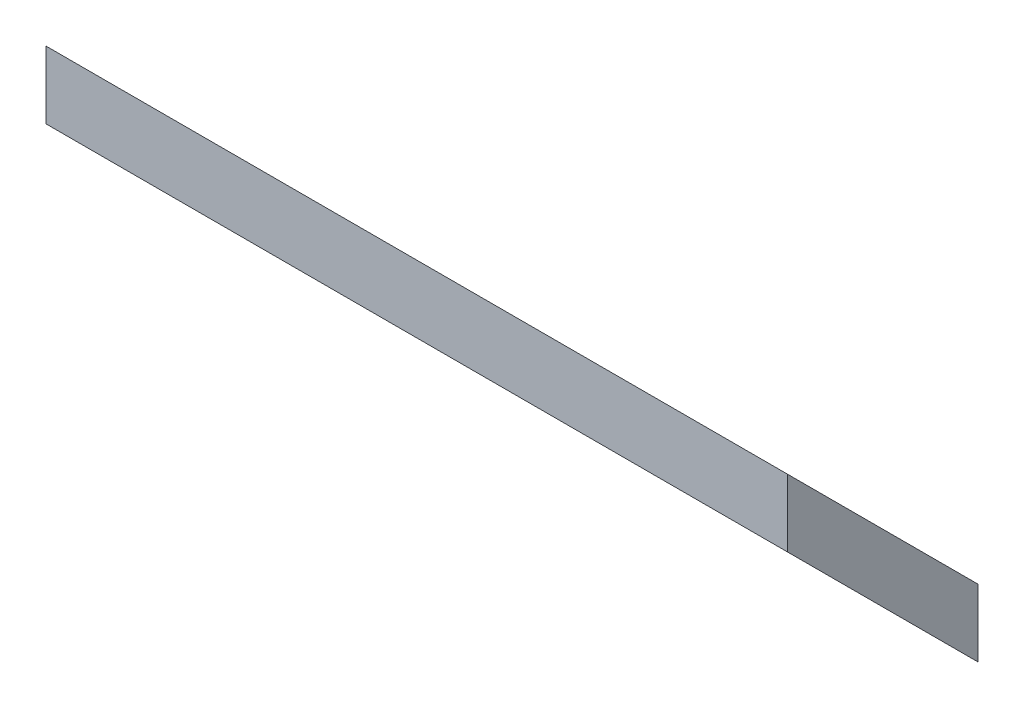
ISO-10303-21;
HEADER;
FILE_DESCRIPTION(('STEP AP214'),'2;1');
FILE_NAME('part.step','',(''),(''),'','','');
FILE_SCHEMA(('AUTOMOTIVE_DESIGN { 1 0 10303 214 1 1 1 1 }'));
ENDSEC;
DATA;
#1=APPLICATION_CONTEXT('core data for automotive mechanical design processes');
#2=APPLICATION_PROTOCOL_DEFINITION('international standard','automotive_design',2000,#1);
#3=PRODUCT_CONTEXT('',#1,'mechanical');
#4=PRODUCT('Part','Part','',(#3));
#5=PRODUCT_RELATED_PRODUCT_CATEGORY('part','',(#4));
#6=PRODUCT_DEFINITION_FORMATION('','',#4);
#7=PRODUCT_DEFINITION_CONTEXT('part definition',#1,'design');
#8=PRODUCT_DEFINITION('design','',#6,#7);
#9=PRODUCT_DEFINITION_SHAPE('','',#8);
#10=(LENGTH_UNIT() NAMED_UNIT(*) SI_UNIT(.MILLI.,.METRE.));
#11=(NAMED_UNIT(*) PLANE_ANGLE_UNIT() SI_UNIT($,.RADIAN.));
#12=(NAMED_UNIT(*) SI_UNIT($,.STERADIAN.) SOLID_ANGLE_UNIT());
#13=UNCERTAINTY_MEASURE_WITH_UNIT(LENGTH_MEASURE(1.E-05),#10,'distance_accuracy_value','');
#14=(GEOMETRIC_REPRESENTATION_CONTEXT(3) GLOBAL_UNCERTAINTY_ASSIGNED_CONTEXT((#13)) GLOBAL_UNIT_ASSIGNED_CONTEXT((#10,
#11,#12)) REPRESENTATION_CONTEXT('',''));
#15=CARTESIAN_POINT('',(0.,0.,0.));
#16=DIRECTION('',(0.,0.,1.));
#17=DIRECTION('',(1.,0.,0.));
#18=AXIS2_PLACEMENT_3D('',#15,#16,#17);
#19=CARTESIAN_POINT('',(0.,0.,0.));
#20=DIRECTION('',(0.,0.,1.));
#21=DIRECTION('',(1.,0.,0.));
#22=AXIS2_PLACEMENT_3D('',#19,#20,#21);
#23=PLANE('',#22);
#24=DIRECTION('',(0.,1.,0.));
#25=VECTOR('',#24,1.);
#26=CARTESIAN_POINT('',(69.85,12.7,0.));
#27=LINE('',#26,#25);
#28=CARTESIAN_POINT('',(69.85,0.,0.));
#29=VERTEX_POINT('',#28);
#30=CARTESIAN_POINT('',(69.85,12.7,0.));
#31=VERTEX_POINT('',#30);
#32=EDGE_CURVE('E68',#29,#31,#27,.T.);
#33=ORIENTED_EDGE('',*,*,#32,.F.);
#34=DIRECTION('',(1.,0.,0.));
#35=VECTOR('',#34,1.);
#36=CARTESIAN_POINT('',(-69.85,0.,0.));
#37=LINE('',#36,#35);
#38=CARTESIAN_POINT('',(-69.85,0.,0.));
#39=VERTEX_POINT('',#38);
#40=EDGE_CURVE('E72',#39,#29,#37,.T.);
#41=ORIENTED_EDGE('',*,*,#40,.F.);
#42=DIRECTION('',(0.,-1.,0.));
#43=VECTOR('',#42,1.);
#44=CARTESIAN_POINT('',(-69.85,12.7,0.));
#45=LINE('',#44,#43);
#46=CARTESIAN_POINT('',(-69.85,12.7,0.));
#47=VERTEX_POINT('',#46);
#48=EDGE_CURVE('E75',#47,#39,#45,.T.);
#49=ORIENTED_EDGE('',*,*,#48,.F.);
#50=DIRECTION('',(-1.,0.,0.));
#51=VECTOR('',#50,1.);
#52=CARTESIAN_POINT('',(69.85,12.7,0.));
#53=LINE('',#52,#51);
#54=EDGE_CURVE('E63',#31,#47,#53,.T.);
#55=ORIENTED_EDGE('',*,*,#54,.F.);
#56=EDGE_LOOP('',(#33,#41,#49,#55));
#57=FACE_BOUND('',#56,.T.);
#58=ADVANCED_FACE('F33',(#57),#23,.F.);
#59=CARTESIAN_POINT('',(0.,35.9210244842767,35.9210244842766));
#60=DIRECTION('',(0.,0.,1.));
#61=DIRECTION('',(1.,0.,0.));
#62=AXIS2_PLACEMENT_3D('',#59,#60,#61);
#63=PLANE('',#62);
#64=DIRECTION('',(0.,1.,0.));
#65=VECTOR('',#64,1.);
#66=CARTESIAN_POINT('',(69.85,48.6210244842766,35.9210244842766));
#67=LINE('',#66,#65);
#68=CARTESIAN_POINT('',(69.85,35.9210244842767,35.9210244842766));
#69=VERTEX_POINT('',#68);
#70=CARTESIAN_POINT('',(69.85,48.6210244842766,35.9210244842766));
#71=VERTEX_POINT('',#70);
#72=EDGE_CURVE('E46',#69,#71,#67,.T.);
#73=ORIENTED_EDGE('',*,*,#72,.T.);
#74=DIRECTION('',(-1.,0.,0.));
#75=VECTOR('',#74,1.);
#76=CARTESIAN_POINT('',(69.85,48.6210244842766,35.9210244842766));
#77=LINE('',#76,#75);
#78=CARTESIAN_POINT('',(-69.85,48.6210244842766,35.9210244842766));
#79=VERTEX_POINT('',#78);
#80=EDGE_CURVE('E11',#71,#79,#77,.T.);
#81=ORIENTED_EDGE('',*,*,#80,.T.);
#82=DIRECTION('',(0.,-1.,0.));
#83=VECTOR('',#82,1.);
#84=CARTESIAN_POINT('',(-69.85,48.6210244842766,35.9210244842766));
#85=LINE('',#84,#83);
#86=CARTESIAN_POINT('',(-69.85,35.9210244842767,35.9210244842766));
#87=VERTEX_POINT('',#86);
#88=EDGE_CURVE('E89',#79,#87,#85,.T.);
#89=ORIENTED_EDGE('',*,*,#88,.T.);
#90=DIRECTION('',(1.,0.,0.));
#91=VECTOR('',#90,1.);
#92=CARTESIAN_POINT('',(-69.85,35.9210244842767,35.9210244842766));
#93=LINE('',#92,#91);
#94=EDGE_CURVE('E52',#87,#69,#93,.T.);
#95=ORIENTED_EDGE('',*,*,#94,.T.);
#96=EDGE_LOOP('',(#73,#81,#89,#95));
#97=FACE_BOUND('',#96,.T.);
#98=ADVANCED_FACE('F114',(#97),#63,.T.);
#99=CARTESIAN_POINT('',(-69.85,12.7,0.));
#100=DIRECTION('',(-1.,0.,0.));
#101=DIRECTION('',(0.,0.,1.));
#102=AXIS2_PLACEMENT_3D('',#99,#100,#101);
#103=PLANE('',#102);
#104=DIRECTION('',(0.,0.707106781186549,0.707106781186546));
#105=VECTOR('',#104,1.);
#106=CARTESIAN_POINT('',(-69.85,0.,0.));
#107=LINE('',#106,#105);
#108=EDGE_CURVE('E91',#39,#87,#107,.T.);
#109=ORIENTED_EDGE('',*,*,#108,.T.);
#110=ORIENTED_EDGE('',*,*,#88,.F.);
#111=DIRECTION('',(0.,0.707106781186549,0.707106781186546));
#112=VECTOR('',#111,1.);
#113=CARTESIAN_POINT('',(-69.85,12.7,0.));
#114=LINE('',#113,#112);
#115=EDGE_CURVE('E85',#47,#79,#114,.T.);
#116=ORIENTED_EDGE('',*,*,#115,.F.);
#117=ORIENTED_EDGE('',*,*,#48,.T.);
#118=EDGE_LOOP('',(#109,#110,#116,#117));
#119=FACE_BOUND('',#118,.T.);
#120=ADVANCED_FACE('F88',(#119),#103,.T.);
#121=CARTESIAN_POINT('',(-69.85,0.,0.));
#122=DIRECTION('',(0.,-0.707106781186546,0.707106781186549));
#123=DIRECTION('',(0.,-0.707106781186549,-0.707106781186546));
#124=AXIS2_PLACEMENT_3D('',#121,#122,#123);
#125=PLANE('',#124);
#126=DIRECTION('',(0.,0.707106781186549,0.707106781186546));
#127=VECTOR('',#126,1.);
#128=CARTESIAN_POINT('',(69.85,0.,0.));
#129=LINE('',#128,#127);
#130=EDGE_CURVE('E97',#29,#69,#129,.T.);
#131=ORIENTED_EDGE('',*,*,#130,.T.);
#132=ORIENTED_EDGE('',*,*,#94,.F.);
#133=ORIENTED_EDGE('',*,*,#108,.F.);
#134=ORIENTED_EDGE('',*,*,#40,.T.);
#135=EDGE_LOOP('',(#131,#132,#133,#134));
#136=FACE_BOUND('',#135,.T.);
#137=ADVANCED_FACE('F106',(#136),#125,.T.);
#138=CARTESIAN_POINT('',(69.85,12.7,0.));
#139=DIRECTION('',(1.,0.,0.));
#140=DIRECTION('',(0.,0.,-1.));
#141=AXIS2_PLACEMENT_3D('',#138,#139,#140);
#142=PLANE('',#141);
#143=DIRECTION('',(0.,0.707106781186549,0.707106781186546));
#144=VECTOR('',#143,1.);
#145=CARTESIAN_POINT('',(69.85,12.7,0.));
#146=LINE('',#145,#144);
#147=EDGE_CURVE('E40',#31,#71,#146,.T.);
#148=ORIENTED_EDGE('',*,*,#147,.T.);
#149=ORIENTED_EDGE('',*,*,#72,.F.);
#150=ORIENTED_EDGE('',*,*,#130,.F.);
#151=ORIENTED_EDGE('',*,*,#32,.T.);
#152=EDGE_LOOP('',(#148,#149,#150,#151));
#153=FACE_BOUND('',#152,.T.);
#154=ADVANCED_FACE('F103',(#153),#142,.T.);
#155=CARTESIAN_POINT('',(69.85,12.7,0.));
#156=DIRECTION('',(0.,0.707106781186546,-0.707106781186549));
#157=DIRECTION('',(0.,0.707106781186549,0.707106781186546));
#158=AXIS2_PLACEMENT_3D('',#155,#156,#157);
#159=PLANE('',#158);
#160=ORIENTED_EDGE('',*,*,#80,.F.);
#161=ORIENTED_EDGE('',*,*,#147,.F.);
#162=ORIENTED_EDGE('',*,*,#54,.T.);
#163=ORIENTED_EDGE('',*,*,#115,.T.);
#164=EDGE_LOOP('',(#160,#161,#162,#163));
#165=FACE_BOUND('',#164,.T.);
#166=ADVANCED_FACE('F84',(#165),#159,.T.);
#167=CLOSED_SHELL('',(#58,#98,#120,#137,#154,#166));
#168=MANIFOLD_SOLID_BREP('B2',#167);
#169=ADVANCED_BREP_SHAPE_REPRESENTATION('',(#18,#168),#14);
#170=SHAPE_DEFINITION_REPRESENTATION(#9,#169);
ENDSEC;
END-ISO-10303-21;
